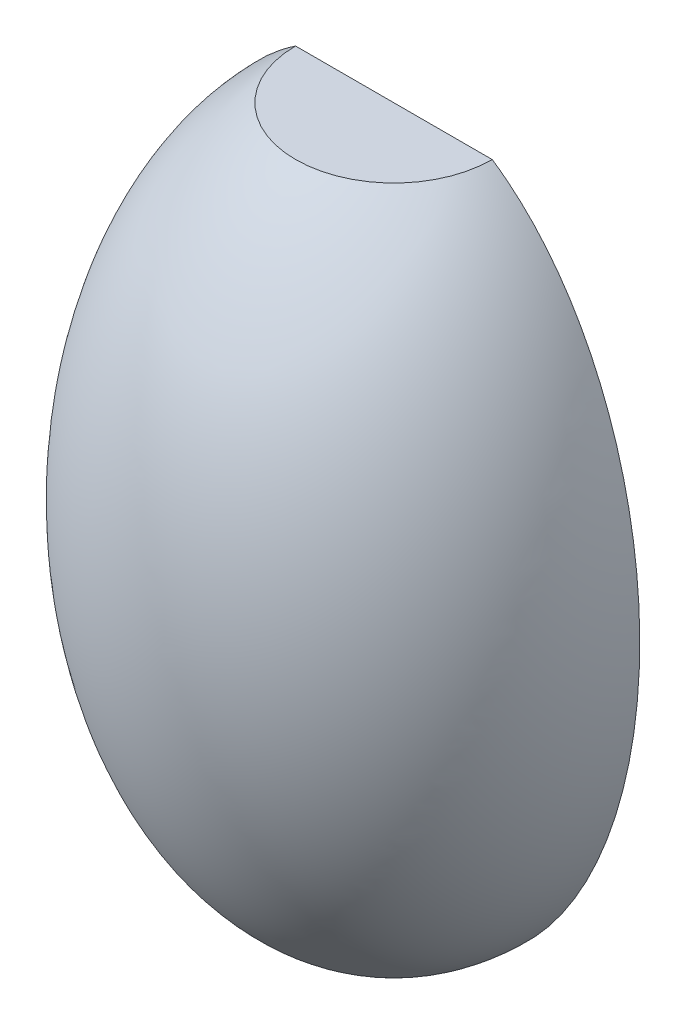
ISO-10303-21;
HEADER;
FILE_DESCRIPTION(('STEP AP214'),'2;1');
FILE_NAME('part.step','',(''),(''),'','','');
FILE_SCHEMA(('AUTOMOTIVE_DESIGN { 1 0 10303 214 1 1 1 1 }'));
ENDSEC;
DATA;
#1=APPLICATION_CONTEXT('core data for automotive mechanical design processes');
#2=APPLICATION_PROTOCOL_DEFINITION('international standard','automotive_design',2000,#1);
#3=PRODUCT_CONTEXT('',#1,'mechanical');
#4=PRODUCT('Part','Part','',(#3));
#5=PRODUCT_RELATED_PRODUCT_CATEGORY('part','',(#4));
#6=PRODUCT_DEFINITION_FORMATION('','',#4);
#7=PRODUCT_DEFINITION_CONTEXT('part definition',#1,'design');
#8=PRODUCT_DEFINITION('design','',#6,#7);
#9=PRODUCT_DEFINITION_SHAPE('','',#8);
#10=(LENGTH_UNIT() NAMED_UNIT(*) SI_UNIT(.MILLI.,.METRE.));
#11=(NAMED_UNIT(*) PLANE_ANGLE_UNIT() SI_UNIT($,.RADIAN.));
#12=(NAMED_UNIT(*) SI_UNIT($,.STERADIAN.) SOLID_ANGLE_UNIT());
#13=UNCERTAINTY_MEASURE_WITH_UNIT(LENGTH_MEASURE(1.E-05),#10,'distance_accuracy_value','');
#14=(GEOMETRIC_REPRESENTATION_CONTEXT(3) GLOBAL_UNCERTAINTY_ASSIGNED_CONTEXT((#13)) GLOBAL_UNIT_ASSIGNED_CONTEXT((#10,
#11,#12)) REPRESENTATION_CONTEXT('',''));
#15=CARTESIAN_POINT('',(0.,0.,0.));
#16=DIRECTION('',(0.,0.,1.));
#17=DIRECTION('',(1.,0.,0.));
#18=AXIS2_PLACEMENT_3D('',#15,#16,#17);
#19=CARTESIAN_POINT('',(0.,-35.,0.));
#20=DIRECTION('',(0.,-1.,0.));
#21=DIRECTION('',(0.,0.,-1.));
#22=AXIS2_PLACEMENT_3D('',#19,#20,#21);
#23=PLANE('',#22);
#24=DIRECTION('',(-1.,0.,0.));
#25=VECTOR('',#24,1.);
#26=CARTESIAN_POINT('',(0.,-35.,0.));
#27=LINE('',#26,#25);
#28=CARTESIAN_POINT('',(9.99999999999999,-35.,0.));
#29=VERTEX_POINT('',#28);
#30=CARTESIAN_POINT('',(-9.99999999999999,-35.,0.));
#31=VERTEX_POINT('',#30);
#32=EDGE_CURVE('E132',#29,#31,#27,.T.);
#33=ORIENTED_EDGE('',*,*,#32,.F.);
#34=CARTESIAN_POINT('',(0.,-35.,0.));
#35=DIRECTION('',(0.,-1.,0.));
#36=DIRECTION('',(0.,0.,-1.));
#37=AXIS2_PLACEMENT_3D('',#34,#35,#36);
#38=CIRCLE('',#37,9.99999999999999);
#39=EDGE_CURVE('E95',#29,#31,#38,.T.);
#40=ORIENTED_EDGE('',*,*,#39,.T.);
#41=EDGE_LOOP('',(#33,#40));
#42=FACE_BOUND('',#41,.T.);
#43=ADVANCED_FACE('F39',(#42),#23,.T.);
#44=CARTESIAN_POINT('',(0.,0.,0.));
#45=DIRECTION('',(0.,0.,1.));
#46=DIRECTION('',(0.,1.,0.));
#47=AXIS2_PLACEMENT_3D('',#44,#45,#46);
#48=ELLIPSE('',#47,38.1881307912987,25.);
#49=TRIMMED_CURVE('',#48,(PARAMETER_VALUE(3.14159265358979)),
(PARAMETER_VALUE(6.28318530717959)),.T.,.PARAMETER.);
#50=CARTESIAN_POINT('',(0.,0.,0.));
#51=DIRECTION('',(0.,-1.,0.));
#52=AXIS1_PLACEMENT('',#50,#51);
#53=SURFACE_OF_REVOLUTION('',#49,#52);
#54=CARTESIAN_POINT('',(0.,0.,0.));
#55=DIRECTION('',(0.,0.,-1.));
#56=DIRECTION('',(0.,1.,0.));
#57=AXIS2_PLACEMENT_3D('',#54,#55,#56);
#58=ELLIPSE('',#57,38.1881307912987,25.);
#59=CARTESIAN_POINT('',(-10.,35.,0.));
#60=VERTEX_POINT('',#59);
#61=EDGE_CURVE('E56',#31,#60,#58,.T.);
#62=ORIENTED_EDGE('',*,*,#61,.F.);
#63=ORIENTED_EDGE('',*,*,#39,.F.);
#64=CARTESIAN_POINT('',(0.,0.,0.));
#65=DIRECTION('',(0.,0.,1.));
#66=DIRECTION('',(0.,1.,0.));
#67=AXIS2_PLACEMENT_3D('',#64,#65,#66);
#68=ELLIPSE('',#67,38.1881307912987,25.);
#69=CARTESIAN_POINT('',(10.,35.,0.));
#70=VERTEX_POINT('',#69);
#71=EDGE_CURVE('E138',#70,#29,#68,.F.);
#72=ORIENTED_EDGE('',*,*,#71,.F.);
#73=CARTESIAN_POINT('',(0.,35.,0.));
#74=DIRECTION('',(0.,-1.,0.));
#75=DIRECTION('',(0.,0.,-1.));
#76=AXIS2_PLACEMENT_3D('',#73,#74,#75);
#77=CIRCLE('',#76,10.);
#78=EDGE_CURVE('E101',#70,#60,#77,.T.);
#79=ORIENTED_EDGE('',*,*,#78,.T.);
#80=EDGE_LOOP('',(#62,#63,#72,#79));
#81=FACE_BOUND('',#80,.T.);
#82=ADVANCED_FACE('F125',(#81),#53,.F.);
#83=CARTESIAN_POINT('',(0.,35.,0.));
#84=DIRECTION('',(0.,1.,0.));
#85=DIRECTION('',(0.,0.,1.));
#86=AXIS2_PLACEMENT_3D('',#83,#84,#85);
#87=PLANE('',#86);
#88=DIRECTION('',(1.,0.,0.));
#89=VECTOR('',#88,1.);
#90=CARTESIAN_POINT('',(0.,35.,0.));
#91=LINE('',#90,#89);
#92=EDGE_CURVE('E143',#60,#70,#91,.T.);
#93=ORIENTED_EDGE('',*,*,#92,.F.);
#94=ORIENTED_EDGE('',*,*,#78,.F.);
#95=EDGE_LOOP('',(#93,#94));
#96=FACE_BOUND('',#95,.T.);
#97=ADVANCED_FACE('F117',(#96),#87,.T.);
#98=CARTESIAN_POINT('',(0.,0.,0.));
#99=DIRECTION('',(0.,0.,1.));
#100=DIRECTION('',(1.,0.,0.));
#101=AXIS2_PLACEMENT_3D('',#98,#99,#100);
#102=PLANE('',#101);
#103=ORIENTED_EDGE('',*,*,#32,.T.);
#104=ORIENTED_EDGE('',*,*,#61,.T.);
#105=ORIENTED_EDGE('',*,*,#92,.T.);
#106=ORIENTED_EDGE('',*,*,#71,.T.);
#107=EDGE_LOOP('',(#103,#104,#105,#106));
#108=FACE_BOUND('',#107,.T.);
#109=DIRECTION('',(1.,0.,0.));
#110=VECTOR('',#109,1.);
#111=CARTESIAN_POINT('',(0.,33.,0.));
#112=LINE('',#111,#110);
#113=CARTESIAN_POINT('',(-9.37869221812549,33.,0.));
#114=VERTEX_POINT('',#113);
#115=CARTESIAN_POINT('',(9.37869221812549,33.,0.));
#116=VERTEX_POINT('',#115);
#117=EDGE_CURVE('E64',#114,#116,#112,.T.);
#118=ORIENTED_EDGE('',*,*,#117,.F.);
#119=CARTESIAN_POINT('',(-9.37869221812548,-33.,0.));
#120=CARTESIAN_POINT('',(-9.71122097633218,-32.7639211217788,0.));
#121=CARTESIAN_POINT('',(-10.0366443578465,-32.5179946176805,0.));
#122=CARTESIAN_POINT('',(-10.672736552393,-32.0087795010403,0.));
#123=CARTESIAN_POINT('',(-10.9834291185333,-31.745520596428,0.));
#124=CARTESIAN_POINT('',(-11.590482684902,-31.2033012184536,0.));
#125=CARTESIAN_POINT('',(-11.8868504529257,-30.9243482972872,0.));
#126=CARTESIAN_POINT('',(-12.4632603916534,-30.3545701899579,0.));
#127=CARTESIAN_POINT('',(-12.7434139123311,-30.0638574302212,0.));
#128=CARTESIAN_POINT('',(-13.2902731953815,-29.4698299641836,0.));
#129=CARTESIAN_POINT('',(-13.5569729964431,-29.1665097782703,0.));
#130=CARTESIAN_POINT('',(-14.0771358462107,-28.5486116319384,0.));
#131=CARTESIAN_POINT('',(-14.3305950962542,-28.2340304839449,0.));
#132=CARTESIAN_POINT('',(-14.9789536382316,-27.3949852408991,0.));
#133=CARTESIAN_POINT('',(-15.3632126786518,-26.8622618114128,0.));
#134=CARTESIAN_POINT('',(-16.0988869281062,-25.7744928125054,0.));
#135=CARTESIAN_POINT('',(-16.450291769414,-25.2194402752408,0.));
#136=CARTESIAN_POINT('',(-17.1216072865148,-24.0905738382598,0.));
#137=CARTESIAN_POINT('',(-17.4415147354711,-23.5167580242932,0.));
#138=CARTESIAN_POINT('',(-18.0529018062545,-22.3499638953855,0.));
#139=CARTESIAN_POINT('',(-18.344205059533,-21.7568934591565,0.));
#140=CARTESIAN_POINT('',(-18.8974726831517,-20.5573658622659,0.));
#141=CARTESIAN_POINT('',(-19.1594416824907,-19.9509108318499,0.));
#142=CARTESIAN_POINT('',(-19.6552393969806,-18.7265783253695,0.));
#143=CARTESIAN_POINT('',(-19.8890651381031,-18.1086996500608,0.));
#144=CARTESIAN_POINT('',(-20.427681390234,-16.5859573862732,0.));
#145=CARTESIAN_POINT('',(-20.717696302461,-15.6758398480828,0.));
#146=CARTESIAN_POINT('',(-21.2436278832948,-13.8398763009148,0.));
#147=CARTESIAN_POINT('',(-21.4795253183192,-12.914024825206,0.));
#148=CARTESIAN_POINT('',(-21.8991774694129,-11.0504662595474,0.));
#149=CARTESIAN_POINT('',(-22.0829243084265,-10.1127574009255,0.));
#150=CARTESIAN_POINT('',(-22.3997089798854,-8.22927028412587,0.));
#151=CARTESIAN_POINT('',(-22.5327689943629,-7.28349574142408,0.));
#152=CARTESIAN_POINT('',(-22.7493798819301,-5.38649977652448,0.));
#153=CARTESIAN_POINT('',(-22.8329400501923,-4.43527941084733,0.));
#154=CARTESIAN_POINT('',(-22.9512748600141,-2.52982762875136,0.));
#155=CARTESIAN_POINT('',(-22.9860510257828,-1.57559630734063,0.));
#156=CARTESIAN_POINT('',(-23.0046531611589,0.111439259954389,0.));
#157=CARTESIAN_POINT('',(-22.9984439403436,0.844151070212248,0.));
#158=CARTESIAN_POINT('',(-22.9574168320097,2.30884767056931,0.));
#159=CARTESIAN_POINT('',(-22.9225966265889,3.0408323969536,0.));
#160=CARTESIAN_POINT('',(-22.8241678555003,4.50302111194789,0.));
#161=CARTESIAN_POINT('',(-22.7605531518131,5.23322468749284,0.));
#162=CARTESIAN_POINT('',(-22.6042345049002,6.69043989119976,0.));
#163=CARTESIAN_POINT('',(-22.5115336901288,7.41745185412295,0.));
#164=CARTESIAN_POINT('',(-22.2965962859198,8.86705548331571,0.));
#165=CARTESIAN_POINT('',(-22.174361697553,9.58964744566435,0.));
#166=CARTESIAN_POINT('',(-21.8997436869805,11.0291291876211,0.));
#167=CARTESIAN_POINT('',(-21.7473588453278,11.7460186971093,0.));
#168=CARTESIAN_POINT('',(-21.4117477602519,13.1722607391321,0.));
#169=CARTESIAN_POINT('',(-21.228533570906,13.8816161026693,0.));
#170=CARTESIAN_POINT('',(-20.8303180617842,15.2912640530362,0.));
#171=CARTESIAN_POINT('',(-20.6153217425204,15.9915580467405,0.));
#172=CARTESIAN_POINT('',(-20.1947646856966,17.2540644274608,0.));
#173=CARTESIAN_POINT('',(-19.9946724193292,17.8181018453507,0.));
#174=CARTESIAN_POINT('',(-19.5718443480483,18.9375431186239,0.));
#175=CARTESIAN_POINT('',(-19.3491122626554,19.4929483749637,0.));
#176=CARTESIAN_POINT('',(-18.8801994786652,20.5937782153549,0.));
#177=CARTESIAN_POINT('',(-18.6340191926247,21.1392029748059,0.));
#178=CARTESIAN_POINT('',(-18.1185610485159,22.2158706277905,0.));
#179=CARTESIAN_POINT('',(-17.849398460115,22.7471685796631,0.));
#180=CARTESIAN_POINT('',(-17.2860255729616,23.7963809589012,0.));
#181=CARTESIAN_POINT('',(-16.9918139342753,24.3142946683772,0.));
#182=CARTESIAN_POINT('',(-16.3772917317062,25.3345627339882,0.));
#183=CARTESIAN_POINT('',(-16.0569772471645,25.836914737051,0.));
#184=CARTESIAN_POINT('',(-15.4364912030315,26.7535120865151,0.));
#185=CARTESIAN_POINT('',(-15.1398809461163,27.1701677564723,0.));
#186=CARTESIAN_POINT('',(-14.5260903812544,27.9879053696037,0.));
#187=CARTESIAN_POINT('',(-14.2089158556087,28.3889916403357,0.));
#188=CARTESIAN_POINT('',(-13.5535012313188,29.1731636683076,0.));
#189=CARTESIAN_POINT('',(-13.2152752189716,29.5562611676488,0.));
#190=CARTESIAN_POINT('',(-12.5131883682632,30.3061665630182,0.));
#191=CARTESIAN_POINT('',(-12.1490876053305,30.6727504548464,0.));
#192=CARTESIAN_POINT('',(-11.3978736542841,31.3822105799578,0.));
#193=CARTESIAN_POINT('',(-11.0107442589185,31.7250697400276,0.));
#194=CARTESIAN_POINT('',(-10.2125271510342,32.3839505590364,0.));
#195=CARTESIAN_POINT('',(-9.80137626527485,32.6998955382864,0.));
#196=CARTESIAN_POINT('',(-9.37869221812549,33.,0.));
#197=B_SPLINE_CURVE_WITH_KNOTS('',3,(#119,#120,#121,#122,#123,#124,#125,#126,#127,#128,#129,
#130,#131,#132,#133,#134,#135,#136,#137,#138,#139,#140,#141,#142,#143,#144,#145,#146,#147,#148,
#149,#150,#151,#152,#153,#154,#155,#156,#157,#158,#159,#160,#161,#162,#163,#164,#165,#166,#167,
#168,#169,#170,#171,#172,#173,#174,#175,#176,#177,#178,#179,#180,#181,#182,#183,#184,#185,#186,
#187,#188,#189,#190,#191,#192,#193,#194,#195,#196),.UNSPECIFIED.,.F.,.F.,(4,2,2,2,2,2,2,2,2,2,2,
2,2,2,2,2,2,2,2,2,2,2,2,2,2,2,2,2,2,2,2,2,2,2,2,2,2,2,4),(0.,1.22311256092845,2.44418068462149,
3.6646661561092,4.87541799179221,6.08670167941388,7.29833099228718,9.2674548722199,
11.2371980615161,13.2071428370394,15.1885577496269,17.1696595493694,19.1509705178336,
22.0147095695778,24.8794648350805,27.7446525758436,30.6085849824514,33.4719794239311,
36.3352843994171,38.5329732090588,40.7308400807371,42.9291756845858,45.1272749200657,
47.3252252643318,49.5232791107698,51.7204755207609,53.9173265971781,55.7123071485856,
57.5069932758689,59.3016478325754,61.0877776561284,62.8740030841562,64.6604973002892,
66.1942504831297,67.727574257053,69.2598828359156,70.8089514826639,72.3591235472483,
73.9135738936601),.UNSPECIFIED.);
#198=CARTESIAN_POINT('',(-9.37869221812548,-33.,0.));
#199=VERTEX_POINT('',#198);
#200=EDGE_CURVE('E49',#199,#114,#197,.T.);
#201=ORIENTED_EDGE('',*,*,#200,.F.);
#202=DIRECTION('',(-1.,0.,0.));
#203=VECTOR('',#202,1.);
#204=CARTESIAN_POINT('',(0.,-33.,0.));
#205=LINE('',#204,#203);
#206=CARTESIAN_POINT('',(9.37869221812548,-33.,0.));
#207=VERTEX_POINT('',#206);
#208=EDGE_CURVE('E81',#207,#199,#205,.T.);
#209=ORIENTED_EDGE('',*,*,#208,.F.);
#210=CARTESIAN_POINT('',(0.,-40.1881307912987,0.));
#211=CARTESIAN_POINT('',(-2.55011730539178,-36.073857673265,0.));
#212=CARTESIAN_POINT('',(-1.26575317008279,-36.1947857387415,0.));
#213=CARTESIAN_POINT('',(0.0897604110107833,-36.1878583826758,0.));
#214=CARTESIAN_POINT('',(0.112208403635997,-36.1877075551546,0.));
#215=CARTESIAN_POINT('',(0.157096693868984,-36.1872919492565,0.));
#216=CARTESIAN_POINT('',(0.179536991174623,-36.1870271668263,0.));
#217=CARTESIAN_POINT('',(0.22441925012022,-36.1863947321523,0.));
#218=CARTESIAN_POINT('',(0.246861211785086,-36.1860270744192,0.));
#219=CARTESIAN_POINT('',(0.314188796046347,-36.1847656576498,0.));
#220=CARTESIAN_POINT('',(0.35907105212093,-36.1837135022806,0.));
#221=CARTESIAN_POINT('',(0.448833433209718,-36.1811889830264,0.));
#222=CARTESIAN_POINT('',(0.493713555727,-36.1797165295518,0.));
#223=CARTESIAN_POINT('',(0.628371667786311,-36.1746671449343,0.));
#224=CARTESIAN_POINT('',(0.718126916111101,-36.1704589485511,0.));
#225=CARTESIAN_POINT('',(0.897617584445673,-36.1603604606035,0.));
#226=CARTESIAN_POINT('',(0.987352922556275,-36.1544687403867,0.));
#227=CARTESIAN_POINT('',(1.25669891896297,-36.1342560312533,0.));
#228=CARTESIAN_POINT('',(1.43612693140002,-36.1174096046424,0.));
#229=CARTESIAN_POINT('',(1.79483085595178,-36.0769921501899,0.));
#230=CARTESIAN_POINT('',(1.97410421646689,-36.0533986455722,0.));
#231=CARTESIAN_POINT('',(2.33245266932601,-35.9994857300428,0.));
#232=CARTESIAN_POINT('',(2.5115233340062,-35.9691368731004,0.));
#233=CARTESIAN_POINT('',(2.86940898855508,-35.9017104598574,0.));
#234=CARTESIAN_POINT('',(3.04821719082495,-35.8645969159127,0.));
#235=CARTESIAN_POINT('',(3.40551873752164,-35.7836370592799,0.));
#236=CARTESIAN_POINT('',(3.5840025531266,-35.7397487234425,0.));
#237=CARTESIAN_POINT('',(3.94059102360944,-35.6452347076997,0.));
#238=CARTESIAN_POINT('',(4.11868308180448,-35.5945615402843,0.));
#239=CARTESIAN_POINT('',(4.4744189048798,-35.4864734966382,0.));
#240=CARTESIAN_POINT('',(4.652046756498,-35.4290062875746,0.));
#241=CARTESIAN_POINT('',(5.00677970752439,-35.3073267961454,0.));
#242=CARTESIAN_POINT('',(5.18386540210381,-35.2430579860073,0.));
#243=CARTESIAN_POINT('',(5.53743416029701,-35.1077737207429,0.));
#244=CARTESIAN_POINT('',(5.71389422726025,-35.0366982084489,0.));
#245=CARTESIAN_POINT('',(6.06612641476259,-34.8878015393399,0.));
#246=CARTESIAN_POINT('',(6.24187191748377,-34.8099174615314,0.));
#247=CARTESIAN_POINT('',(6.59258435578264,-34.647407974578,0.));
#248=CARTESIAN_POINT('',(6.76752108898031,-34.5627174328006,0.));
#249=CARTESIAN_POINT('',(7.11652030133012,-34.3866033302586,0.));
#250=CARTESIAN_POINT('',(7.290549089341,-34.2951130524705,0.));
#251=CARTESIAN_POINT('',(7.63763200750145,-34.1054123938844,0.));
#252=CARTESIAN_POINT('',(7.81064910530084,-34.0071343044722,0.));
#253=CARTESIAN_POINT('',(8.15560389411316,-33.8038761110872,0.));
#254=CARTESIAN_POINT('',(8.32750140203026,-33.6988278585545,0.));
#255=CARTESIAN_POINT('',(8.67010854909608,-33.4820529146668,0.));
#256=CARTESIAN_POINT('',(8.84077508196209,-33.3702581380163,0.));
#257=CARTESIAN_POINT('',(9.18080800266961,-33.1400200784943,0.));
#258=CARTESIAN_POINT('',(9.3501286076646,-33.0215092333796,0.));
#259=CARTESIAN_POINT('',(9.68735643536643,-32.7778736732068,0.));
#260=CARTESIAN_POINT('',(9.85521549496521,-32.6526823020023,0.));
#261=CARTESIAN_POINT('',(10.1893977307406,-32.3957325758086,0.));
#262=CARTESIAN_POINT('',(10.355670554583,-32.2639088999519,0.));
#263=CARTESIAN_POINT('',(10.8553505925691,-31.8559303374094,0.));
#264=CARTESIAN_POINT('',(11.1826855730861,-31.572288767013,0.));
#265=CARTESIAN_POINT('',(11.8299687611765,-30.9796622334416,0.));
#266=CARTESIAN_POINT('',(12.1494769470521,-30.6701989950993,0.));
#267=CARTESIAN_POINT('',(12.7801808751162,-30.0264644792562,0.));
#268=CARTESIAN_POINT('',(13.0909241262888,-29.6917505396065,0.));
#269=CARTESIAN_POINT('',(13.7031391342872,-28.9981790315946,0.));
#270=CARTESIAN_POINT('',(14.0041530170368,-28.6389182353678,0.));
#271=CARTESIAN_POINT('',(14.5959766174461,-27.8970037871231,0.));
#272=CARTESIAN_POINT('',(14.8863305278368,-27.5139872530585,0.));
#273=CARTESIAN_POINT('',(15.455923634637,-26.7254039131671,0.));
#274=CARTESIAN_POINT('',(15.734715135635,-26.3195143679796,0.));
#275=CARTESIAN_POINT('',(16.2803061223171,-25.4861104091449,0.));
#276=CARTESIAN_POINT('',(16.546671144786,-25.0583120979674,0.));
#277=CARTESIAN_POINT('',(17.0665697999256,-24.1820934209176,0.));
#278=CARTESIAN_POINT('',(17.3196863453407,-23.7334260191694,0.));
#279=CARTESIAN_POINT('',(17.8122912738065,-22.8165429213585,0.));
#280=CARTESIAN_POINT('',(18.0513832508711,-22.3481146159098,0.));
#281=CARTESIAN_POINT('',(18.5151881007094,-21.3928484267834,0.));
#282=CARTESIAN_POINT('',(18.7395278234117,-20.9058296680766,0.));
#283=CARTESIAN_POINT('',(19.1731255514805,-19.9145804286607,0.));
#284=CARTESIAN_POINT('',(19.3820356258669,-19.4101979961498,0.));
#285=CARTESIAN_POINT('',(19.7841216074515,-18.3854729008263,0.));
#286=CARTESIAN_POINT('',(19.9769762635076,-17.865004378315,0.));
#287=CARTESIAN_POINT('',(20.3463504879929,-16.8094070038026,0.));
#288=CARTESIAN_POINT('',(20.5225765421967,-16.2741755990401,0.));
#289=CARTESIAN_POINT('',(20.8581451829729,-15.1903958085716,0.));
#290=CARTESIAN_POINT('',(21.0172227316339,-14.6417654791877,0.));
#291=CARTESIAN_POINT('',(21.3179992734483,-13.5325699062303,0.));
#292=CARTESIAN_POINT('',(21.4594622000573,-12.9719407403426,0.));
#293=CARTESIAN_POINT('',(21.7245682623589,-11.8401637483193,0.));
#294=CARTESIAN_POINT('',(21.8480046149113,-11.2689675529522,0.));
#295=CARTESIAN_POINT('',(22.0766705647505,-10.1175025787339,0.));
#296=CARTESIAN_POINT('',(22.1817228418353,-9.53719863449878,0.));
#297=CARTESIAN_POINT('',(22.3732882598475,-8.36898983396988,0.));
#298=CARTESIAN_POINT('',(22.4596536314383,-7.78106077872138,0.));
#299=CARTESIAN_POINT('',(22.6135676718988,-6.59909490489096,0.));
#300=CARTESIAN_POINT('',(22.680998151195,-6.00504271624777,0.));
#301=CARTESIAN_POINT('',(22.7968198214613,-4.81234117311126,0.));
#302=CARTESIAN_POINT('',(22.8451223978589,-4.21368322468256,0.));
#303=CARTESIAN_POINT('',(22.9225207721459,-3.01329424992322,0.));
#304=CARTESIAN_POINT('',(22.9515575111655,-2.41155942057835,0.));
#305=CARTESIAN_POINT('',(22.9903118867517,-1.20655035966754,0.));
#306=CARTESIAN_POINT('',(23.,-0.603275179833773,0.));
#307=CARTESIAN_POINT('',(23.,0.603275179833758,0.));
#308=CARTESIAN_POINT('',(22.9903118867517,1.20655035966753,0.));
#309=CARTESIAN_POINT('',(22.9515575111665,2.41155942054756,0.));
#310=CARTESIAN_POINT('',(22.9225207721489,3.01329424986168,0.));
#311=CARTESIAN_POINT('',(22.8451223978638,4.21368322462115,0.));
#312=CARTESIAN_POINT('',(22.7968198214643,4.8123411730806,0.));
#313=CARTESIAN_POINT('',(22.6809981511921,6.00504271627798,0.));
#314=CARTESIAN_POINT('',(22.613567671892,6.59909490495129,0.));
#315=CARTESIAN_POINT('',(22.4596536314295,7.78106077878145,0.));
#316=CARTESIAN_POINT('',(22.3732882598426,8.36898983399983,0.));
#317=CARTESIAN_POINT('',(22.1817228418353,9.53719863449877,0.));
#318=CARTESIAN_POINT('',(22.0766705647505,10.1175025787339,0.));
#319=CARTESIAN_POINT('',(21.8480046149172,11.2689675529222,0.));
#320=CARTESIAN_POINT('',(21.7245682623717,11.8401637482597,0.));
#321=CARTESIAN_POINT('',(21.4594622000731,12.9719407402794,0.));
#322=CARTESIAN_POINT('',(21.3179992734583,13.5325699061928,0.));
#323=CARTESIAN_POINT('',(21.0172227316442,14.6417654791502,0.));
#324=CARTESIAN_POINT('',(20.8581451829911,15.1903958085089,0.));
#325=CARTESIAN_POINT('',(20.5225765422281,16.2741755989425,0.));
#326=CARTESIAN_POINT('',(20.3463504880288,16.8094070036953,0.));
#327=CARTESIAN_POINT('',(19.9769762635363,17.8650043782375,0.));
#328=CARTESIAN_POINT('',(19.7841216074665,18.3854729007878,0.));
#329=CARTESIAN_POINT('',(19.382035625883,19.4101979961089,0.));
#330=CARTESIAN_POINT('',(19.1731255515141,19.9145804285795,0.));
#331=CARTESIAN_POINT('',(18.7395278234544,20.9058296679832,0.));
#332=CARTESIAN_POINT('',(18.515188100741,21.3928484267169,0.));
#333=CARTESIAN_POINT('',(18.0513832508713,22.3481146159107,0.));
#334=CARTESIAN_POINT('',(17.8122912737859,22.8165429213996,0.));
#335=CARTESIAN_POINT('',(17.3196863452965,23.733426019249,0.));
#336=CARTESIAN_POINT('',(17.0665697998804,24.1820934209964,0.));
#337=CARTESIAN_POINT('',(16.5466711447593,25.0583120980098,0.));
#338=CARTESIAN_POINT('',(16.2803061223115,25.4861104091526,0.));
#339=CARTESIAN_POINT('',(15.7347151356467,26.3195143679626,0.));
#340=CARTESIAN_POINT('',(15.455923634643,26.7254039131587,0.));
#341=CARTESIAN_POINT('',(14.8863305278197,27.5139872530822,0.));
#342=CARTESIAN_POINT('',(14.5959766174108,27.8970037871696,0.));
#343=CARTESIAN_POINT('',(14.0041530169679,28.638918235452,0.));
#344=CARTESIAN_POINT('',(13.7031391342031,28.9981790316938,0.));
#345=CARTESIAN_POINT('',(13.0909241262294,29.6917505396701,0.));
#346=CARTESIAN_POINT('',(12.7801808750998,30.0264644792718,0.));
#347=CARTESIAN_POINT('',(12.1494769470943,30.6701989950572,0.));
#348=CARTESIAN_POINT('',(11.8299687612325,30.9796622333879,0.));
#349=CARTESIAN_POINT('',(11.1826855730878,31.5722887670138,0.));
#350=CARTESIAN_POINT('',(10.8553505924986,31.8559303374718,0.));
#351=CARTESIAN_POINT('',(10.3556705545251,32.2639088999969,0.));
#352=CARTESIAN_POINT('',(10.1893977307731,32.3957325757816,0.));
#353=CARTESIAN_POINT('',(9.85521549499622,32.6526823019804,0.));
#354=CARTESIAN_POINT('',(9.68735643530124,32.7778736732565,0.));
#355=CARTESIAN_POINT('',(9.35012860749816,33.0215092334973,0.));
#356=CARTESIAN_POINT('',(9.18080800250021,33.1400200786116,0.));
#357=CARTESIAN_POINT('',(8.84077508179617,33.3702581381261,0.));
#358=CARTESIAN_POINT('',(8.6701085489368,33.4820529147699,0.));
#359=CARTESIAN_POINT('',(8.32750140187443,33.6988278586508,0.));
#360=CARTESIAN_POINT('',(8.15560389395396,33.8038761111832,0.));
#361=CARTESIAN_POINT('',(7.81064910519194,34.0071343045342,0.));
#362=CARTESIAN_POINT('',(7.63763200744727,34.1054123939145,0.));
#363=CARTESIAN_POINT('',(7.29054908926344,34.2951130525124,0.));
#364=CARTESIAN_POINT('',(7.11652030117214,34.3866033303398,0.));
#365=CARTESIAN_POINT('',(6.76752108876318,34.5627174329086,0.));
#366=CARTESIAN_POINT('',(6.59258435558822,34.6474079746764,0.));
#367=CARTESIAN_POINT('',(6.24187191735535,34.8099174615827,0.));
#368=CARTESIAN_POINT('',(6.06612641467883,34.8878015393555,0.));
#369=CARTESIAN_POINT('',(5.71389422724975,35.036698208473,0.));
#370=CARTESIAN_POINT('',(5.5374341603112,35.1077737208053,0.));
#371=CARTESIAN_POINT('',(5.18386540179583,35.243057986058,0.));
#372=CARTESIAN_POINT('',(5.00677970687708,35.3073267961522,0.));
#373=CARTESIAN_POINT('',(4.65204675699045,35.429006287619,0.));
#374=CARTESIAN_POINT('',(4.47441890683145,35.4864734967575,0.));
#375=CARTESIAN_POINT('',(4.11868307961458,35.5945615402432,0.));
#376=CARTESIAN_POINT('',(3.94059101588158,35.6452347074343,0.));
#377=CARTESIAN_POINT('',(3.58400256105088,35.7397487236389,0.));
#378=CARTESIAN_POINT('',(3.40551876643556,35.783637060147,0.));
#379=CARTESIAN_POINT('',(3.04821716218582,35.864596915031,0.));
#380=CARTESIAN_POINT('',(2.86940888201367,35.9017104565789,0.));
#381=CARTESIAN_POINT('',(2.51152343996273,35.9691368763617,0.));
#382=CARTESIAN_POINT('',(2.33245306367633,35.999485742179,0.));
#383=CARTESIAN_POINT('',(1.97410382385757,36.0533986334904,0.));
#384=CARTESIAN_POINT('',(1.79482939402164,36.0769921052009,0.));
#385=CARTESIAN_POINT('',(1.43612838850698,36.1174096494703,0.));
#386=CARTESIAN_POINT('',(1.25670434744879,36.1342561982862,0.));
#387=CARTESIAN_POINT('',(0.897756867306827,36.1611917831045,0.));
#388=CARTESIAN_POINT('',(0.718234568312196,36.1712959978714,0.));
#389=CARTESIAN_POINT('',(0.359141644534637,36.1847641650209,0.));
#390=CARTESIAN_POINT('',(0.179571306115205,36.1881357582475,0.));
#391=CARTESIAN_POINT('',(0.,36.1881307912987,0.));
#392=B_SPLINE_CURVE_WITH_KNOTS('',3,(#210,#211,#212,#213,#214,#215,#216,#217,#218,#219,#220,
#221,#222,#223,#224,#225,#226,#227,#228,#229,#230,#231,#232,#233,#234,#235,#236,#237,#238,#239,
#240,#241,#242,#243,#244,#245,#246,#247,#248,#249,#250,#251,#252,#253,#254,#255,#256,#257,#258,
#259,#260,#261,#262,#263,#264,#265,#266,#267,#268,#269,#270,#271,#272,#273,#274,#275,#276,#277,
#278,#279,#280,#281,#282,#283,#284,#285,#286,#287,#288,#289,#290,#291,#292,#293,#294,#295,#296,
#297,#298,#299,#300,#301,#302,#303,#304,#305,#306,#307,#308,#309,#310,#311,#312,#313,#314,#315,
#316,#317,#318,#319,#320,#321,#322,#323,#324,#325,#326,#327,#328,#329,#330,#331,#332,#333,#334,
#335,#336,#337,#338,#339,#340,#341,#342,#343,#344,#345,#346,#347,#348,#349,#350,#351,#352,#353,
#354,#355,#356,#357,#358,#359,#360,#361,#362,#363,#364,#365,#366,#367,#368,#369,#370,#371,#372,
#373,#374,#375,#376,#377,#378,#379,#380,#381,#382,#383,#384,#385,#386,#387,#388,#389,#390,#391),
.UNSPECIFIED.,.F.,.F.,(4,2,2,2,2,2,2,2,2,2,2,2,2,2,2,2,2,2,2,2,2,2,2,2,2,2,2,2,2,2,2,2,2,2,2,2,
2,2,2,2,2,2,2,2,2,2,2,2,2,2,2,2,2,2,2,2,2,2,2,2,2,2,2,2,2,2,2,2,2,2,2,2,2,2,2,2,2,2,2,2,2,2,2,2,
2,2,2,2,2,2,4),(0.,4.0007242985386,4.06805189652108,4.13538188949449,4.20271547577461,
4.33739784515952,4.47210894460491,4.74165260298671,5.01142568119053,5.55193979705507,
6.0942759518332,6.63902408408032,7.18675963008579,7.73804040412547,8.29340377919089,
8.85336420394455,9.41841107998691,9.98900699549778,10.565586327218,11.1485541842623,
11.7382856865233,12.3351255419834,12.9393878963819,13.5513564250664,14.1712846307836,
14.799396314457,15.4358861922946,16.7345082474364,18.0682941182315,19.4378377163894,
20.8433519477711,22.2846994649144,23.761422527532,25.2727713475089,26.8177306250527,
28.3950442072945,30.0032379346307,31.6406408202697,33.3054047427818,34.9955228432364,
36.708846811099,38.4431032311838,40.1959091475457,41.9647869780138,43.7471789013605,
45.5404608195187,47.341955985588,49.1489483779832,50.9586958898902,52.7684434017972,
54.5754357941,56.3769309602617,58.1702128785109,59.9526048017666,61.7214826322347,
63.4742885485052,65.208544968669,66.9218689364523,68.6119870368748,70.2767509595107,
71.9141538450179,73.5223475724415,75.0996611548188,76.6446204323622,78.1559692522173,
79.632692314866,81.0740398320968,82.4795540635423,83.8490976615072,85.1828835322486,
86.4815055876745,87.1179954651655,87.7461071491984,88.366035354922,88.978003883579,
89.5822662379852,90.179106093257,90.7688375957804,91.3518054527734,91.9283847842438,
92.498980700043,93.0640275758249,93.6239880008583,94.1793513753917,94.7306321496908,
95.2783676957032,95.8231158279497,96.3654519827272,96.9059660983129,97.4452592319545,
97.983939973826),.UNSPECIFIED.);
#393=EDGE_CURVE('E11',#116,#207,#392,.F.);
#394=ORIENTED_EDGE('',*,*,#393,.F.);
#395=EDGE_LOOP('',(#118,#201,#209,#394));
#396=FACE_BOUND('',#395,.T.);
#397=ADVANCED_FACE('F79',(#108,#396),#102,.F.);
#398=CARTESIAN_POINT('',(0.,-33.,0.));
#399=DIRECTION('',(0.,-1.,0.));
#400=DIRECTION('',(0.,0.,-1.));
#401=AXIS2_PLACEMENT_3D('',#398,#399,#400);
#402=PLANE('',#401);
#403=CARTESIAN_POINT('',(0.,-33.,0.));
#404=DIRECTION('',(0.,-1.,0.));
#405=DIRECTION('',(0.,0.,-1.));
#406=AXIS2_PLACEMENT_3D('',#403,#404,#405);
#407=CIRCLE('',#406,9.37869221812548);
#408=EDGE_CURVE('E94',#199,#207,#407,.F.);
#409=ORIENTED_EDGE('',*,*,#408,.T.);
#410=ORIENTED_EDGE('',*,*,#208,.T.);
#411=EDGE_LOOP('',(#409,#410));
#412=FACE_BOUND('',#411,.T.);
#413=ADVANCED_FACE('F116',(#412),#402,.F.);
#414=CARTESIAN_POINT('',(0.,33.,0.));
#415=DIRECTION('',(0.,1.,0.));
#416=DIRECTION('',(0.,0.,1.));
#417=AXIS2_PLACEMENT_3D('',#414,#415,#416);
#418=PLANE('',#417);
#419=CARTESIAN_POINT('',(0.,33.,0.));
#420=DIRECTION('',(0.,-1.,0.));
#421=DIRECTION('',(0.,0.,-1.));
#422=AXIS2_PLACEMENT_3D('',#419,#420,#421);
#423=CIRCLE('',#422,9.37869221812549);
#424=EDGE_CURVE('E89',#116,#114,#423,.T.);
#425=ORIENTED_EDGE('',*,*,#424,.T.);
#426=ORIENTED_EDGE('',*,*,#117,.T.);
#427=EDGE_LOOP('',(#425,#426));
#428=FACE_BOUND('',#427,.T.);
#429=ADVANCED_FACE('F88',(#428),#418,.F.);
#430=CARTESIAN_POINT('',(0.,0.,0.));
#431=DIRECTION('',(0.,0.,1.));
#432=DIRECTION('',(0.,1.,0.));
#433=AXIS2_PLACEMENT_3D('',#430,#431,#432);
#434=ELLIPSE('',#433,38.1881307912987,25.);
#435=TRIMMED_CURVE('',#434,(PARAMETER_VALUE(3.14159265358979)),
(PARAMETER_VALUE(6.28318530717959)),.T.,.PARAMETER.);
#436=CARTESIAN_POINT('',(0.,0.,0.));
#437=DIRECTION('',(0.,-1.,0.));
#438=AXIS1_PLACEMENT('',#436,#437);
#439=SURFACE_OF_REVOLUTION('',#435,#438);
#440=OFFSET_SURFACE('',#439,2.,.F.);
#441=ORIENTED_EDGE('',*,*,#424,.F.);
#442=ORIENTED_EDGE('',*,*,#393,.T.);
#443=ORIENTED_EDGE('',*,*,#408,.F.);
#444=ORIENTED_EDGE('',*,*,#200,.T.);
#445=EDGE_LOOP('',(#441,#442,#443,#444));
#446=FACE_BOUND('',#445,.T.);
#447=ADVANCED_FACE('F92',(#446),#440,.T.);
#448=CLOSED_SHELL('',(#43,#82,#97,#397,#413,#429,#447));
#449=MANIFOLD_SOLID_BREP('B2',#448);
#450=ADVANCED_BREP_SHAPE_REPRESENTATION('',(#18,#449),#14);
#451=SHAPE_DEFINITION_REPRESENTATION(#9,#450);
ENDSEC;
END-ISO-10303-21;
